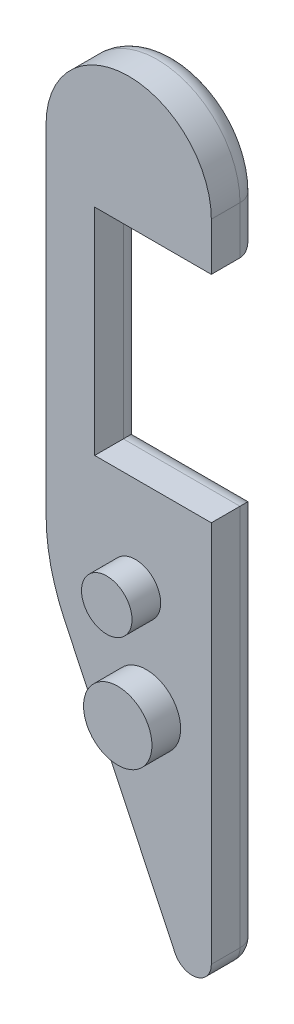
ISO-10303-21;
HEADER;
FILE_DESCRIPTION(('STEP AP214'),'2;1');
FILE_NAME('part.step','',(''),(''),'','','');
FILE_SCHEMA(('AUTOMOTIVE_DESIGN { 1 0 10303 214 1 1 1 1 }'));
ENDSEC;
DATA;
#1=APPLICATION_CONTEXT('core data for automotive mechanical design processes');
#2=APPLICATION_PROTOCOL_DEFINITION('international standard','automotive_design',2000,#1);
#3=PRODUCT_CONTEXT('',#1,'mechanical');
#4=PRODUCT('Part','Part','',(#3));
#5=PRODUCT_RELATED_PRODUCT_CATEGORY('part','',(#4));
#6=PRODUCT_DEFINITION_FORMATION('','',#4);
#7=PRODUCT_DEFINITION_CONTEXT('part definition',#1,'design');
#8=PRODUCT_DEFINITION('design','',#6,#7);
#9=PRODUCT_DEFINITION_SHAPE('','',#8);
#10=(LENGTH_UNIT() NAMED_UNIT(*) SI_UNIT(.MILLI.,.METRE.));
#11=(NAMED_UNIT(*) PLANE_ANGLE_UNIT() SI_UNIT($,.RADIAN.));
#12=(NAMED_UNIT(*) SI_UNIT($,.STERADIAN.) SOLID_ANGLE_UNIT());
#13=UNCERTAINTY_MEASURE_WITH_UNIT(LENGTH_MEASURE(1.E-05),#10,'distance_accuracy_value','');
#14=(GEOMETRIC_REPRESENTATION_CONTEXT(3) GLOBAL_UNCERTAINTY_ASSIGNED_CONTEXT((#13)) GLOBAL_UNIT_ASSIGNED_CONTEXT((#10,
#11,#12)) REPRESENTATION_CONTEXT('',''));
#15=CARTESIAN_POINT('',(0.,0.,0.));
#16=DIRECTION('',(0.,0.,1.));
#17=DIRECTION('',(1.,0.,0.));
#18=AXIS2_PLACEMENT_3D('',#15,#16,#17);
#19=CARTESIAN_POINT('',(-2.,-62.5,5.));
#20=DIRECTION('',(0.,0.,-1.));
#21=DIRECTION('',(-1.,0.,0.));
#22=AXIS2_PLACEMENT_3D('',#19,#20,#21);
#23=PLANE('',#22);
#24=CARTESIAN_POINT('',(-7.93890135304665,-32.4257826385121,5.));
#25=DIRECTION('',(0.,0.,-1.));
#26=DIRECTION('',(-1.,0.,0.));
#27=AXIS2_PLACEMENT_3D('',#24,#25,#26);
#28=CIRCLE('',#27,2.64022715758472);
#29=CARTESIAN_POINT('',(-10.5791285106314,-32.4257826385121,5.));
#30=VERTEX_POINT('',#29);
#31=EDGE_CURVE('E163',#30,#30,#28,.F.);
#32=ORIENTED_EDGE('',*,*,#31,.F.);
#33=EDGE_LOOP('',(#32));
#34=FACE_BOUND('',#33,.T.);
#35=DIRECTION('',(0.,1.,0.));
#36=VECTOR('',#35,1.);
#37=CARTESIAN_POINT('',(0.,5.,5.));
#38=LINE('',#37,#36);
#39=CARTESIAN_POINT('',(0.,0.,5.));
#40=VERTEX_POINT('',#39);
#41=CARTESIAN_POINT('',(0.,5.,5.));
#42=VERTEX_POINT('',#41);
#43=EDGE_CURVE('E152',#40,#42,#38,.T.);
#44=ORIENTED_EDGE('',*,*,#43,.T.);
#45=CARTESIAN_POINT('',(-8.64219265839779,5.,5.));
#46=DIRECTION('',(0.,0.,1.));
#47=DIRECTION('',(-1.,0.,0.));
#48=AXIS2_PLACEMENT_3D('',#45,#46,#47);
#49=CIRCLE('',#48,8.64219265839779);
#50=CARTESIAN_POINT('',(-17.2843853167956,5.,5.));
#51=VERTEX_POINT('',#50);
#52=EDGE_CURVE('E140',#42,#51,#49,.T.);
#53=ORIENTED_EDGE('',*,*,#52,.T.);
#54=DIRECTION('',(0.,-1.,0.));
#55=VECTOR('',#54,1.);
#56=CARTESIAN_POINT('',(-17.2843853167956,-30.408869997568,5.));
#57=LINE('',#56,#55);
#58=CARTESIAN_POINT('',(-17.2843853167956,-30.408869997568,5.));
#59=VERTEX_POINT('',#58);
#60=EDGE_CURVE('E151',#51,#59,#57,.T.);
#61=ORIENTED_EDGE('',*,*,#60,.T.);
#62=CARTESIAN_POINT('',(2.71561468320443,-30.4088699975681,5.));
#63=DIRECTION('',(0.,0.,1.));
#64=DIRECTION('',(-1.,0.,0.));
#65=AXIS2_PLACEMENT_3D('',#62,#63,#64);
#66=CIRCLE('',#65,20.);
#67=CARTESIAN_POINT('',(-15.3589688339794,-38.9709626553443,5.));
#68=VERTEX_POINT('',#67);
#69=EDGE_CURVE('E250',#59,#68,#66,.T.);
#70=ORIENTED_EDGE('',*,*,#69,.T.);
#71=DIRECTION('',(0.428104632888809,-0.903729175859194,0.));
#72=VECTOR('',#71,1.);
#73=CARTESIAN_POINT('',(-3.80745835171839,-63.3562092657776,5.));
#74=LINE('',#73,#72);
#75=CARTESIAN_POINT('',(-3.80745835171839,-63.3562092657776,5.));
#76=VERTEX_POINT('',#75);
#77=EDGE_CURVE('E252',#68,#76,#74,.T.);
#78=ORIENTED_EDGE('',*,*,#77,.T.);
#79=CARTESIAN_POINT('',(-2.,-62.5,5.));
#80=DIRECTION('',(0.,0.,1.));
#81=DIRECTION('',(-1.,0.,0.));
#82=AXIS2_PLACEMENT_3D('',#79,#80,#81);
#83=CIRCLE('',#82,2.);
#84=CARTESIAN_POINT('',(0.,-62.5,5.));
#85=VERTEX_POINT('',#84);
#86=EDGE_CURVE('E254',#76,#85,#83,.T.);
#87=ORIENTED_EDGE('',*,*,#86,.T.);
#88=DIRECTION('',(0.,1.,0.));
#89=VECTOR('',#88,1.);
#90=CARTESIAN_POINT('',(0.,-22.5,5.));
#91=LINE('',#90,#89);
#92=CARTESIAN_POINT('',(0.,-22.5,5.));
#93=VERTEX_POINT('',#92);
#94=EDGE_CURVE('E256',#85,#93,#91,.T.);
#95=ORIENTED_EDGE('',*,*,#94,.T.);
#96=DIRECTION('',(-1.,0.,0.));
#97=VECTOR('',#96,1.);
#98=CARTESIAN_POINT('',(-12.2,-22.5,5.));
#99=LINE('',#98,#97);
#100=CARTESIAN_POINT('',(-12.2,-22.5,5.));
#101=VERTEX_POINT('',#100);
#102=EDGE_CURVE('E258',#93,#101,#99,.T.);
#103=ORIENTED_EDGE('',*,*,#102,.T.);
#104=DIRECTION('',(0.,1.,0.));
#105=VECTOR('',#104,1.);
#106=CARTESIAN_POINT('',(-12.2,0.,5.));
#107=LINE('',#106,#105);
#108=CARTESIAN_POINT('',(-12.2,0.,5.));
#109=VERTEX_POINT('',#108);
#110=EDGE_CURVE('E260',#101,#109,#107,.T.);
#111=ORIENTED_EDGE('',*,*,#110,.T.);
#112=DIRECTION('',(1.,0.,0.));
#113=VECTOR('',#112,1.);
#114=CARTESIAN_POINT('',(0.,0.,5.));
#115=LINE('',#114,#113);
#116=EDGE_CURVE('E157',#109,#40,#115,.T.);
#117=ORIENTED_EDGE('',*,*,#116,.T.);
#118=EDGE_LOOP('',(#44,#53,#61,#70,#78,#87,#95,#103,#111,#117));
#119=FACE_BOUND('',#118,.T.);
#120=CARTESIAN_POINT('',(-6.78837663712528,-42.7720231105724,5.));
#121=DIRECTION('',(0.,0.,-1.));
#122=DIRECTION('',(-1.,0.,0.));
#123=AXIS2_PLACEMENT_3D('',#120,#121,#122);
#124=CIRCLE('',#123,3.5783237132683);
#125=CARTESIAN_POINT('',(-10.3667003503936,-42.7720231105724,5.));
#126=VERTEX_POINT('',#125);
#127=EDGE_CURVE('E166',#126,#126,#124,.F.);
#128=ORIENTED_EDGE('',*,*,#127,.F.);
#129=EDGE_LOOP('',(#128));
#130=FACE_BOUND('',#129,.T.);
#131=ADVANCED_FACE('F33',(#34,#119,#130),#23,.F.);
#132=CARTESIAN_POINT('',(0.,5.,5.));
#133=DIRECTION('',(-1.,0.,0.));
#134=DIRECTION('',(0.,-1.,0.));
#135=AXIS2_PLACEMENT_3D('',#132,#133,#134);
#136=PLANE('',#135);
#137=DIRECTION('',(0.,0.,-1.));
#138=VECTOR('',#137,1.);
#139=CARTESIAN_POINT('',(0.,0.,5.));
#140=LINE('',#139,#138);
#141=CARTESIAN_POINT('',(0.,0.,2.));
#142=VERTEX_POINT('',#141);
#143=EDGE_CURVE('E263',#40,#142,#140,.T.);
#144=ORIENTED_EDGE('',*,*,#143,.T.);
#145=DIRECTION('',(0.,1.,0.));
#146=VECTOR('',#145,1.);
#147=CARTESIAN_POINT('',(0.,5.,2.));
#148=LINE('',#147,#146);
#149=CARTESIAN_POINT('',(0.,5.,2.));
#150=VERTEX_POINT('',#149);
#151=EDGE_CURVE('E11',#142,#150,#148,.T.);
#152=ORIENTED_EDGE('',*,*,#151,.T.);
#153=DIRECTION('',(0.,0.,-1.));
#154=VECTOR('',#153,1.);
#155=CARTESIAN_POINT('',(0.,5.,5.));
#156=LINE('',#155,#154);
#157=EDGE_CURVE('E145',#42,#150,#156,.T.);
#158=ORIENTED_EDGE('',*,*,#157,.F.);
#159=ORIENTED_EDGE('',*,*,#43,.F.);
#160=EDGE_LOOP('',(#144,#152,#158,#159));
#161=FACE_BOUND('',#160,.T.);
#162=ADVANCED_FACE('F161',(#161),#136,.F.);
#163=CARTESIAN_POINT('',(-8.64219265839779,5.,5.));
#164=DIRECTION('',(0.,0.,-1.));
#165=DIRECTION('',(-1.,0.,0.));
#166=AXIS2_PLACEMENT_3D('',#163,#164,#165);
#167=CYLINDRICAL_SURFACE('',#166,8.64219265839779);
#168=ORIENTED_EDGE('',*,*,#157,.T.);
#169=CARTESIAN_POINT('',(-8.64219265839779,5.,2.));
#170=DIRECTION('',(0.,0.,-1.));
#171=DIRECTION('',(-1.,0.,0.));
#172=AXIS2_PLACEMENT_3D('',#169,#170,#171);
#173=CIRCLE('',#172,8.64219265839779);
#174=CARTESIAN_POINT('',(-17.2843853167956,5.,2.));
#175=VERTEX_POINT('',#174);
#176=EDGE_CURVE('E174',#150,#175,#173,.F.);
#177=ORIENTED_EDGE('',*,*,#176,.T.);
#178=DIRECTION('',(0.,0.,-1.));
#179=VECTOR('',#178,1.);
#180=CARTESIAN_POINT('',(-17.2843853167956,5.,5.));
#181=LINE('',#180,#179);
#182=EDGE_CURVE('E148',#51,#175,#181,.T.);
#183=ORIENTED_EDGE('',*,*,#182,.F.);
#184=ORIENTED_EDGE('',*,*,#52,.F.);
#185=EDGE_LOOP('',(#168,#177,#183,#184));
#186=FACE_BOUND('',#185,.T.);
#187=ADVANCED_FACE('F142',(#186),#167,.T.);
#188=CARTESIAN_POINT('',(-17.2843853167956,-30.408869997568,5.));
#189=DIRECTION('',(1.,0.,0.));
#190=DIRECTION('',(0.,0.,-1.));
#191=AXIS2_PLACEMENT_3D('',#188,#189,#190);
#192=PLANE('',#191);
#193=ORIENTED_EDGE('',*,*,#182,.T.);
#194=DIRECTION('',(0.,-1.,0.));
#195=VECTOR('',#194,1.);
#196=CARTESIAN_POINT('',(-17.2843853167956,-30.408869997568,2.));
#197=LINE('',#196,#195);
#198=CARTESIAN_POINT('',(-17.2843853167956,-30.408869997568,2.));
#199=VERTEX_POINT('',#198);
#200=EDGE_CURVE('E195',#175,#199,#197,.T.);
#201=ORIENTED_EDGE('',*,*,#200,.T.);
#202=DIRECTION('',(0.,0.,-1.));
#203=VECTOR('',#202,1.);
#204=CARTESIAN_POINT('',(-17.2843853167956,-30.408869997568,5.));
#205=LINE('',#204,#203);
#206=EDGE_CURVE('E168',#59,#199,#205,.T.);
#207=ORIENTED_EDGE('',*,*,#206,.F.);
#208=ORIENTED_EDGE('',*,*,#60,.F.);
#209=EDGE_LOOP('',(#193,#201,#207,#208));
#210=FACE_BOUND('',#209,.T.);
#211=ADVANCED_FACE('F379',(#210),#192,.F.);
#212=CARTESIAN_POINT('',(2.71561468320443,-30.4088699975681,5.));
#213=DIRECTION('',(0.,0.,-1.));
#214=DIRECTION('',(-1.,0.,0.));
#215=AXIS2_PLACEMENT_3D('',#212,#213,#214);
#216=CYLINDRICAL_SURFACE('',#215,20.);
#217=ORIENTED_EDGE('',*,*,#206,.T.);
#218=CARTESIAN_POINT('',(2.71561468320443,-30.4088699975681,2.));
#219=DIRECTION('',(0.,0.,-1.));
#220=DIRECTION('',(-1.,0.,0.));
#221=AXIS2_PLACEMENT_3D('',#218,#219,#220);
#222=CIRCLE('',#221,20.);
#223=CARTESIAN_POINT('',(-15.3589688339794,-38.9709626553443,2.));
#224=VERTEX_POINT('',#223);
#225=EDGE_CURVE('E197',#199,#224,#222,.F.);
#226=ORIENTED_EDGE('',*,*,#225,.T.);
#227=DIRECTION('',(0.,0.,-1.));
#228=VECTOR('',#227,1.);
#229=CARTESIAN_POINT('',(-15.3589688339794,-38.9709626553443,5.));
#230=LINE('',#229,#228);
#231=EDGE_CURVE('E278',#68,#224,#230,.T.);
#232=ORIENTED_EDGE('',*,*,#231,.F.);
#233=ORIENTED_EDGE('',*,*,#69,.F.);
#234=EDGE_LOOP('',(#217,#226,#232,#233));
#235=FACE_BOUND('',#234,.T.);
#236=ADVANCED_FACE('F285',(#235),#216,.T.);
#237=CARTESIAN_POINT('',(-3.80745835171839,-63.3562092657776,5.));
#238=DIRECTION('',(0.903729175859194,0.428104632888809,0.));
#239=DIRECTION('',(-0.428104632888809,0.903729175859194,0.));
#240=AXIS2_PLACEMENT_3D('',#237,#238,#239);
#241=PLANE('',#240);
#242=ORIENTED_EDGE('',*,*,#231,.T.);
#243=DIRECTION('',(0.428104632888809,-0.903729175859194,0.));
#244=VECTOR('',#243,1.);
#245=CARTESIAN_POINT('',(-3.80745835171839,-63.3562092657776,2.));
#246=LINE('',#245,#244);
#247=CARTESIAN_POINT('',(-3.80745835171839,-63.3562092657776,2.));
#248=VERTEX_POINT('',#247);
#249=EDGE_CURVE('E199',#224,#248,#246,.T.);
#250=ORIENTED_EDGE('',*,*,#249,.T.);
#251=DIRECTION('',(0.,0.,-1.));
#252=VECTOR('',#251,1.);
#253=CARTESIAN_POINT('',(-3.80745835171839,-63.3562092657776,5.));
#254=LINE('',#253,#252);
#255=EDGE_CURVE('E275',#76,#248,#254,.T.);
#256=ORIENTED_EDGE('',*,*,#255,.F.);
#257=ORIENTED_EDGE('',*,*,#77,.F.);
#258=EDGE_LOOP('',(#242,#250,#256,#257));
#259=FACE_BOUND('',#258,.T.);
#260=ADVANCED_FACE('F338',(#259),#241,.F.);
#261=CARTESIAN_POINT('',(-2.,-62.5,5.));
#262=DIRECTION('',(0.,0.,-1.));
#263=DIRECTION('',(-1.,0.,0.));
#264=AXIS2_PLACEMENT_3D('',#261,#262,#263);
#265=CYLINDRICAL_SURFACE('',#264,2.);
#266=ORIENTED_EDGE('',*,*,#255,.T.);
#267=CARTESIAN_POINT('',(-2.,-62.5,2.));
#268=DIRECTION('',(0.,0.,-1.));
#269=DIRECTION('',(-1.,0.,0.));
#270=AXIS2_PLACEMENT_3D('',#267,#268,#269);
#271=CIRCLE('',#270,2.);
#272=CARTESIAN_POINT('',(0.,-62.5,2.));
#273=VERTEX_POINT('',#272);
#274=EDGE_CURVE('E201',#248,#273,#271,.F.);
#275=ORIENTED_EDGE('',*,*,#274,.T.);
#276=DIRECTION('',(0.,0.,-1.));
#277=VECTOR('',#276,1.);
#278=CARTESIAN_POINT('',(0.,-62.5,5.));
#279=LINE('',#278,#277);
#280=EDGE_CURVE('E272',#85,#273,#279,.T.);
#281=ORIENTED_EDGE('',*,*,#280,.F.);
#282=ORIENTED_EDGE('',*,*,#86,.F.);
#283=EDGE_LOOP('',(#266,#275,#281,#282));
#284=FACE_BOUND('',#283,.T.);
#285=ADVANCED_FACE('F341',(#284),#265,.T.);
#286=CARTESIAN_POINT('',(0.,-22.5,5.));
#287=DIRECTION('',(-1.,0.,0.));
#288=DIRECTION('',(0.,-1.,0.));
#289=AXIS2_PLACEMENT_3D('',#286,#287,#288);
#290=PLANE('',#289);
#291=ORIENTED_EDGE('',*,*,#280,.T.);
#292=DIRECTION('',(0.,1.,0.));
#293=VECTOR('',#292,1.);
#294=CARTESIAN_POINT('',(0.,-22.5,2.));
#295=LINE('',#294,#293);
#296=CARTESIAN_POINT('',(0.,-22.5,2.));
#297=VERTEX_POINT('',#296);
#298=EDGE_CURVE('E203',#273,#297,#295,.T.);
#299=ORIENTED_EDGE('',*,*,#298,.T.);
#300=DIRECTION('',(0.,0.,-1.));
#301=VECTOR('',#300,1.);
#302=CARTESIAN_POINT('',(0.,-22.5,5.));
#303=LINE('',#302,#301);
#304=EDGE_CURVE('E269',#93,#297,#303,.T.);
#305=ORIENTED_EDGE('',*,*,#304,.F.);
#306=ORIENTED_EDGE('',*,*,#94,.F.);
#307=EDGE_LOOP('',(#291,#299,#305,#306));
#308=FACE_BOUND('',#307,.T.);
#309=ADVANCED_FACE('F329',(#308),#290,.F.);
#310=CARTESIAN_POINT('',(-12.2,-22.5,5.));
#311=DIRECTION('',(0.,-1.,0.));
#312=DIRECTION('',(0.,0.,-1.));
#313=AXIS2_PLACEMENT_3D('',#310,#311,#312);
#314=PLANE('',#313);
#315=ORIENTED_EDGE('',*,*,#304,.T.);
#316=DIRECTION('',(-1.,0.,0.));
#317=VECTOR('',#316,1.);
#318=CARTESIAN_POINT('',(-12.2,-22.5,2.));
#319=LINE('',#318,#317);
#320=CARTESIAN_POINT('',(-12.2,-22.5,2.));
#321=VERTEX_POINT('',#320);
#322=EDGE_CURVE('E205',#297,#321,#319,.T.);
#323=ORIENTED_EDGE('',*,*,#322,.T.);
#324=DIRECTION('',(0.,0.,-1.));
#325=VECTOR('',#324,1.);
#326=CARTESIAN_POINT('',(-12.2,-22.5,5.));
#327=LINE('',#326,#325);
#328=EDGE_CURVE('E267',#101,#321,#327,.T.);
#329=ORIENTED_EDGE('',*,*,#328,.F.);
#330=ORIENTED_EDGE('',*,*,#102,.F.);
#331=EDGE_LOOP('',(#315,#323,#329,#330));
#332=FACE_BOUND('',#331,.T.);
#333=ADVANCED_FACE('F320',(#332),#314,.F.);
#334=CARTESIAN_POINT('',(-12.2,0.,5.));
#335=DIRECTION('',(-1.,0.,0.));
#336=DIRECTION('',(0.,-1.,0.));
#337=AXIS2_PLACEMENT_3D('',#334,#335,#336);
#338=PLANE('',#337);
#339=ORIENTED_EDGE('',*,*,#328,.T.);
#340=DIRECTION('',(0.,1.,0.));
#341=VECTOR('',#340,1.);
#342=CARTESIAN_POINT('',(-12.2,0.,2.));
#343=LINE('',#342,#341);
#344=CARTESIAN_POINT('',(-12.2,0.,2.));
#345=VERTEX_POINT('',#344);
#346=EDGE_CURVE('E57',#321,#345,#343,.T.);
#347=ORIENTED_EDGE('',*,*,#346,.T.);
#348=DIRECTION('',(0.,0.,-1.));
#349=VECTOR('',#348,1.);
#350=CARTESIAN_POINT('',(-12.2,0.,5.));
#351=LINE('',#350,#349);
#352=EDGE_CURVE('E265',#109,#345,#351,.T.);
#353=ORIENTED_EDGE('',*,*,#352,.F.);
#354=ORIENTED_EDGE('',*,*,#110,.F.);
#355=EDGE_LOOP('',(#339,#347,#353,#354));
#356=FACE_BOUND('',#355,.T.);
#357=ADVANCED_FACE('F324',(#356),#338,.F.);
#358=CARTESIAN_POINT('',(0.,0.,5.));
#359=DIRECTION('',(0.,1.,0.));
#360=DIRECTION('',(-1.,0.,0.));
#361=AXIS2_PLACEMENT_3D('',#358,#359,#360);
#362=PLANE('',#361);
#363=ORIENTED_EDGE('',*,*,#352,.T.);
#364=DIRECTION('',(1.,0.,0.));
#365=VECTOR('',#364,1.);
#366=CARTESIAN_POINT('',(0.,0.,2.));
#367=LINE('',#366,#365);
#368=EDGE_CURVE('E42',#345,#142,#367,.T.);
#369=ORIENTED_EDGE('',*,*,#368,.T.);
#370=ORIENTED_EDGE('',*,*,#143,.F.);
#371=ORIENTED_EDGE('',*,*,#116,.F.);
#372=EDGE_LOOP('',(#363,#369,#370,#371));
#373=FACE_BOUND('',#372,.T.);
#374=ADVANCED_FACE('F364',(#373),#362,.F.);
#375=CARTESIAN_POINT('',(-2.,-62.5,0.));
#376=DIRECTION('',(0.,0.,-1.));
#377=DIRECTION('',(-1.,0.,0.));
#378=AXIS2_PLACEMENT_3D('',#375,#376,#377);
#379=PLANE('',#378);
#380=DIRECTION('',(0.,-1.,0.));
#381=VECTOR('',#380,1.);
#382=CARTESIAN_POINT('',(-15.2843853167956,5.,0.));
#383=LINE('',#382,#381);
#384=CARTESIAN_POINT('',(-15.2843853167956,-30.408869997568,0.));
#385=VERTEX_POINT('',#384);
#386=CARTESIAN_POINT('',(-15.2843853167956,5.,0.));
#387=VERTEX_POINT('',#386);
#388=EDGE_CURVE('E190',#385,#387,#383,.F.);
#389=ORIENTED_EDGE('',*,*,#388,.T.);
#390=CARTESIAN_POINT('',(-8.64219265839779,5.,0.));
#391=DIRECTION('',(0.,0.,-1.));
#392=DIRECTION('',(-1.,0.,0.));
#393=AXIS2_PLACEMENT_3D('',#390,#391,#392);
#394=CIRCLE('',#393,6.64219265839779);
#395=CARTESIAN_POINT('',(-2.,5.,0.));
#396=VERTEX_POINT('',#395);
#397=EDGE_CURVE('E192',#387,#396,#394,.T.);
#398=ORIENTED_EDGE('',*,*,#397,.T.);
#399=DIRECTION('',(0.,1.,0.));
#400=VECTOR('',#399,1.);
#401=CARTESIAN_POINT('',(-2.,0.,0.));
#402=LINE('',#401,#400);
#403=CARTESIAN_POINT('',(-2.,2.,0.));
#404=VERTEX_POINT('',#403);
#405=EDGE_CURVE('E176',#396,#404,#402,.F.);
#406=ORIENTED_EDGE('',*,*,#405,.T.);
#407=DIRECTION('',(1.,0.,0.));
#408=VECTOR('',#407,1.);
#409=CARTESIAN_POINT('',(-12.2,2.,0.));
#410=LINE('',#409,#408);
#411=CARTESIAN_POINT('',(-14.2,2.,0.));
#412=VERTEX_POINT('',#411);
#413=EDGE_CURVE('E178',#404,#412,#410,.F.);
#414=ORIENTED_EDGE('',*,*,#413,.T.);
#415=DIRECTION('',(0.,1.,0.));
#416=VECTOR('',#415,1.);
#417=CARTESIAN_POINT('',(-14.2,-22.5,0.));
#418=LINE('',#417,#416);
#419=CARTESIAN_POINT('',(-14.2,-24.5,0.));
#420=VERTEX_POINT('',#419);
#421=EDGE_CURVE('E180',#412,#420,#418,.F.);
#422=ORIENTED_EDGE('',*,*,#421,.T.);
#423=DIRECTION('',(-1.,0.,0.));
#424=VECTOR('',#423,1.);
#425=CARTESIAN_POINT('',(0.,-24.5,0.));
#426=LINE('',#425,#424);
#427=CARTESIAN_POINT('',(-2.,-24.5,0.));
#428=VERTEX_POINT('',#427);
#429=EDGE_CURVE('E182',#420,#428,#426,.F.);
#430=ORIENTED_EDGE('',*,*,#429,.T.);
#431=DIRECTION('',(0.,1.,0.));
#432=VECTOR('',#431,1.);
#433=CARTESIAN_POINT('',(-2.,-62.5,0.));
#434=LINE('',#433,#432);
#435=CARTESIAN_POINT('',(-2.,-62.5,0.));
#436=VERTEX_POINT('',#435);
#437=EDGE_CURVE('E184',#428,#436,#434,.F.);
#438=ORIENTED_EDGE('',*,*,#437,.T.);
#439=DIRECTION('',(0.428104632888809,-0.903729175859194,0.));
#440=VECTOR('',#439,1.);
#441=CARTESIAN_POINT('',(-13.551510482261,-38.1147533895667,0.));
#442=LINE('',#441,#440);
#443=CARTESIAN_POINT('',(-13.551510482261,-38.1147533895667,0.));
#444=VERTEX_POINT('',#443);
#445=EDGE_CURVE('E186',#436,#444,#442,.F.);
#446=ORIENTED_EDGE('',*,*,#445,.T.);
#447=CARTESIAN_POINT('',(2.71561468320443,-30.4088699975681,0.));
#448=DIRECTION('',(0.,0.,-1.));
#449=DIRECTION('',(-1.,0.,0.));
#450=AXIS2_PLACEMENT_3D('',#447,#448,#449);
#451=CIRCLE('',#450,18.);
#452=EDGE_CURVE('E188',#444,#385,#451,.T.);
#453=ORIENTED_EDGE('',*,*,#452,.T.);
#454=EDGE_LOOP('',(#389,#398,#406,#414,#422,#430,#438,#446,#453));
#455=FACE_BOUND('',#454,.T.);
#456=ADVANCED_FACE('F300',(#455),#379,.T.);
#457=CARTESIAN_POINT('',(-7.93890135304665,-32.4257826385121,8.));
#458=DIRECTION('',(0.,0.,-1.));
#459=DIRECTION('',(-1.,0.,0.));
#460=AXIS2_PLACEMENT_3D('',#457,#458,#459);
#461=CYLINDRICAL_SURFACE('',#460,2.64022715758472);
#462=CARTESIAN_POINT('',(-7.93890135304665,-32.4257826385121,8.));
#463=DIRECTION('',(0.,0.,1.));
#464=DIRECTION('',(1.,0.,0.));
#465=AXIS2_PLACEMENT_3D('',#462,#463,#464);
#466=CIRCLE('',#465,2.64022715758472);
#467=CARTESIAN_POINT('',(-5.29867419546193,-32.4257826385121,8.));
#468=VERTEX_POINT('',#467);
#469=EDGE_CURVE('E159',#468,#468,#466,.T.);
#470=ORIENTED_EDGE('',*,*,#469,.F.);
#471=EDGE_LOOP('',(#470));
#472=FACE_BOUND('',#471,.T.);
#473=ORIENTED_EDGE('',*,*,#31,.T.);
#474=EDGE_LOOP('',(#473));
#475=FACE_BOUND('',#474,.T.);
#476=ADVANCED_FACE('F360',(#472,#475),#461,.T.);
#477=CARTESIAN_POINT('',(-7.93890135304665,-32.4257826385121,8.));
#478=DIRECTION('',(0.,0.,1.));
#479=DIRECTION('',(1.,0.,0.));
#480=AXIS2_PLACEMENT_3D('',#477,#478,#479);
#481=PLANE('',#480);
#482=ORIENTED_EDGE('',*,*,#469,.T.);
#483=EDGE_LOOP('',(#482));
#484=FACE_BOUND('',#483,.T.);
#485=ADVANCED_FACE('F469',(#484),#481,.T.);
#486=CARTESIAN_POINT('',(-6.78837663712528,-42.7720231105724,8.));
#487=DIRECTION('',(0.,0.,-1.));
#488=DIRECTION('',(-1.,0.,0.));
#489=AXIS2_PLACEMENT_3D('',#486,#487,#488);
#490=CYLINDRICAL_SURFACE('',#489,3.5783237132683);
#491=CARTESIAN_POINT('',(-6.78837663712528,-42.7720231105724,8.));
#492=DIRECTION('',(0.,0.,1.));
#493=DIRECTION('',(1.,0.,0.));
#494=AXIS2_PLACEMENT_3D('',#491,#492,#493);
#495=CIRCLE('',#494,3.5783237132683);
#496=CARTESIAN_POINT('',(-3.21005292385698,-42.7720231105724,8.));
#497=VERTEX_POINT('',#496);
#498=EDGE_CURVE('E237',#497,#497,#495,.T.);
#499=ORIENTED_EDGE('',*,*,#498,.F.);
#500=EDGE_LOOP('',(#499));
#501=FACE_BOUND('',#500,.T.);
#502=ORIENTED_EDGE('',*,*,#127,.T.);
#503=EDGE_LOOP('',(#502));
#504=FACE_BOUND('',#503,.T.);
#505=ADVANCED_FACE('F460',(#501,#504),#490,.T.);
#506=CARTESIAN_POINT('',(-6.78837663712528,-42.7720231105724,8.));
#507=DIRECTION('',(0.,0.,1.));
#508=DIRECTION('',(1.,0.,0.));
#509=AXIS2_PLACEMENT_3D('',#506,#507,#508);
#510=PLANE('',#509);
#511=ORIENTED_EDGE('',*,*,#498,.T.);
#512=EDGE_LOOP('',(#511));
#513=FACE_BOUND('',#512,.T.);
#514=ADVANCED_FACE('F452',(#513),#510,.T.);
#515=CARTESIAN_POINT('',(-2.,-22.5,2.));
#516=DIRECTION('',(0.,-1.,0.));
#517=DIRECTION('',(1.,0.,0.));
#518=AXIS2_PLACEMENT_3D('',#515,#516,#517);
#519=CYLINDRICAL_SURFACE('',#518,2.);
#520=CARTESIAN_POINT('',(-2.,-62.5,2.));
#521=DIRECTION('',(0.,-1.,0.));
#522=DIRECTION('',(0.,0.,-1.));
#523=AXIS2_PLACEMENT_3D('',#520,#521,#522);
#524=CIRCLE('',#523,2.);
#525=EDGE_CURVE('E230',#436,#273,#524,.T.);
#526=ORIENTED_EDGE('',*,*,#525,.F.);
#527=ORIENTED_EDGE('',*,*,#437,.F.);
#528=CARTESIAN_POINT('',(-2.,-24.5,2.));
#529=DIRECTION('',(0.707106781186548,-0.707106781186547,0.));
#530=DIRECTION('',(0.707106781186547,0.707106781186548,0.));
#531=AXIS2_PLACEMENT_3D('',#528,#529,#530);
#532=ELLIPSE('',#531,2.82842712474619,2.);
#533=EDGE_CURVE('E37',#297,#428,#532,.F.);
#534=ORIENTED_EDGE('',*,*,#533,.F.);
#535=ORIENTED_EDGE('',*,*,#298,.F.);
#536=EDGE_LOOP('',(#526,#527,#534,#535));
#537=FACE_BOUND('',#536,.T.);
#538=ADVANCED_FACE('F35',(#537),#519,.T.);
#539=CARTESIAN_POINT('',(-12.2,-24.5,2.));
#540=DIRECTION('',(1.,0.,0.));
#541=DIRECTION('',(0.,0.,-1.));
#542=AXIS2_PLACEMENT_3D('',#539,#540,#541);
#543=CYLINDRICAL_SURFACE('',#542,2.);
#544=ORIENTED_EDGE('',*,*,#533,.T.);
#545=ORIENTED_EDGE('',*,*,#429,.F.);
#546=CARTESIAN_POINT('',(-14.2,-24.5,2.));
#547=DIRECTION('',(0.707106781186547,-0.707106781186547,0.));
#548=DIRECTION('',(0.707106781186547,0.707106781186548,0.));
#549=AXIS2_PLACEMENT_3D('',#546,#547,#548);
#550=ELLIPSE('',#549,2.82842712474619,2.);
#551=EDGE_CURVE('E228',#321,#420,#550,.F.);
#552=ORIENTED_EDGE('',*,*,#551,.F.);
#553=ORIENTED_EDGE('',*,*,#322,.F.);
#554=EDGE_LOOP('',(#544,#545,#552,#553));
#555=FACE_BOUND('',#554,.T.);
#556=ADVANCED_FACE('F317',(#555),#543,.T.);
#557=CARTESIAN_POINT('',(-2.,-62.5,2.));
#558=DIRECTION('',(0.,0.,1.));
#559=DIRECTION('',(1.,0.,0.));
#560=AXIS2_PLACEMENT_3D('',#557,#558,#559);
#561=SPHERICAL_SURFACE('',#560,2.);
#562=ORIENTED_EDGE('',*,*,#525,.T.);
#563=ORIENTED_EDGE('',*,*,#274,.F.);
#564=CARTESIAN_POINT('',(-2.,-62.5,2.));
#565=DIRECTION('',(-0.428104632888809,0.903729175859194,0.));
#566=DIRECTION('',(-0.903729175859194,-0.428104632888809,0.));
#567=AXIS2_PLACEMENT_3D('',#564,#565,#566);
#568=CIRCLE('',#567,2.);
#569=EDGE_CURVE('E225',#436,#248,#568,.T.);
#570=ORIENTED_EDGE('',*,*,#569,.F.);
#571=EDGE_LOOP('',(#562,#563,#570));
#572=FACE_BOUND('',#571,.T.);
#573=ADVANCED_FACE('F342',(#572),#561,.T.);
#574=CARTESIAN_POINT('',(-14.2,0.,2.));
#575=DIRECTION('',(0.,-1.,0.));
#576=DIRECTION('',(1.,0.,0.));
#577=AXIS2_PLACEMENT_3D('',#574,#575,#576);
#578=CYLINDRICAL_SURFACE('',#577,2.);
#579=ORIENTED_EDGE('',*,*,#551,.T.);
#580=ORIENTED_EDGE('',*,*,#421,.F.);
#581=CARTESIAN_POINT('',(-14.2,2.,2.));
#582=DIRECTION('',(-0.707106781186547,-0.707106781186548,0.));
#583=DIRECTION('',(0.707106781186548,-0.707106781186547,0.));
#584=AXIS2_PLACEMENT_3D('',#581,#582,#583);
#585=ELLIPSE('',#584,2.82842712474619,2.);
#586=EDGE_CURVE('E222',#345,#412,#585,.F.);
#587=ORIENTED_EDGE('',*,*,#586,.F.);
#588=ORIENTED_EDGE('',*,*,#346,.F.);
#589=EDGE_LOOP('',(#579,#580,#587,#588));
#590=FACE_BOUND('',#589,.T.);
#591=ADVANCED_FACE('F314',(#590),#578,.T.);
#592=CARTESIAN_POINT('',(-2.,-62.5,2.));
#593=DIRECTION('',(-0.428104632888809,0.903729175859194,0.));
#594=DIRECTION('',(-0.903729175859194,-0.428104632888809,0.));
#595=AXIS2_PLACEMENT_3D('',#592,#593,#594);
#596=CYLINDRICAL_SURFACE('',#595,2.);
#597=ORIENTED_EDGE('',*,*,#569,.T.);
#598=ORIENTED_EDGE('',*,*,#249,.F.);
#599=CARTESIAN_POINT('',(-13.551510482261,-38.1147533895667,2.));
#600=DIRECTION('',(-0.428104632888813,0.903729175859192,0.));
#601=DIRECTION('',(-0.903729175859192,-0.428104632888813,0.));
#602=AXIS2_PLACEMENT_3D('',#599,#600,#601);
#603=CIRCLE('',#602,2.);
#604=EDGE_CURVE('E219',#444,#224,#603,.T.);
#605=ORIENTED_EDGE('',*,*,#604,.F.);
#606=ORIENTED_EDGE('',*,*,#445,.F.);
#607=EDGE_LOOP('',(#597,#598,#605,#606));
#608=FACE_BOUND('',#607,.T.);
#609=ADVANCED_FACE('F335',(#608),#596,.T.);
#610=CARTESIAN_POINT('',(0.,2.,2.));
#611=DIRECTION('',(-1.,0.,0.));
#612=DIRECTION('',(0.,-1.,0.));
#613=AXIS2_PLACEMENT_3D('',#610,#611,#612);
#614=CYLINDRICAL_SURFACE('',#613,2.);
#615=ORIENTED_EDGE('',*,*,#586,.T.);
#616=ORIENTED_EDGE('',*,*,#413,.F.);
#617=CARTESIAN_POINT('',(-2.,2.,2.));
#618=DIRECTION('',(-0.707106781186547,-0.707106781186547,0.));
#619=DIRECTION('',(0.707106781186547,-0.707106781186548,0.));
#620=AXIS2_PLACEMENT_3D('',#617,#618,#619);
#621=ELLIPSE('',#620,2.82842712474619,2.);
#622=EDGE_CURVE('E216',#142,#404,#621,.F.);
#623=ORIENTED_EDGE('',*,*,#622,.F.);
#624=ORIENTED_EDGE('',*,*,#368,.F.);
#625=EDGE_LOOP('',(#615,#616,#623,#624));
#626=FACE_BOUND('',#625,.T.);
#627=ADVANCED_FACE('F311',(#626),#614,.T.);
#628=CARTESIAN_POINT('',(2.71561468320443,-30.4088699975681,2.));
#629=DIRECTION('',(0.,0.,-1.));
#630=DIRECTION('',(-1.,0.,0.));
#631=AXIS2_PLACEMENT_3D('',#628,#629,#630);
#632=TOROIDAL_SURFACE('',#631,18.,2.);
#633=ORIENTED_EDGE('',*,*,#604,.T.);
#634=ORIENTED_EDGE('',*,*,#225,.F.);
#635=CARTESIAN_POINT('',(-15.2843853167956,-30.408869997568,2.));
#636=DIRECTION('',(0.,1.,0.));
#637=DIRECTION('',(0.,0.,1.));
#638=AXIS2_PLACEMENT_3D('',#635,#636,#637);
#639=CIRCLE('',#638,2.);
#640=EDGE_CURVE('E213',#385,#199,#639,.T.);
#641=ORIENTED_EDGE('',*,*,#640,.F.);
#642=ORIENTED_EDGE('',*,*,#452,.F.);
#643=EDGE_LOOP('',(#633,#634,#641,#642));
#644=FACE_BOUND('',#643,.T.);
#645=ADVANCED_FACE('F290',(#644),#632,.T.);
#646=CARTESIAN_POINT('',(-2.,5.,2.));
#647=DIRECTION('',(0.,-1.,0.));
#648=DIRECTION('',(1.,0.,0.));
#649=AXIS2_PLACEMENT_3D('',#646,#647,#648);
#650=CYLINDRICAL_SURFACE('',#649,2.);
#651=ORIENTED_EDGE('',*,*,#622,.T.);
#652=ORIENTED_EDGE('',*,*,#405,.F.);
#653=CARTESIAN_POINT('',(-2.,5.,2.));
#654=DIRECTION('',(0.,1.,0.));
#655=DIRECTION('',(0.,0.,1.));
#656=AXIS2_PLACEMENT_3D('',#653,#654,#655);
#657=CIRCLE('',#656,2.);
#658=EDGE_CURVE('E211',#150,#396,#657,.T.);
#659=ORIENTED_EDGE('',*,*,#658,.F.);
#660=ORIENTED_EDGE('',*,*,#151,.F.);
#661=EDGE_LOOP('',(#651,#652,#659,#660));
#662=FACE_BOUND('',#661,.T.);
#663=ADVANCED_FACE('F306',(#662),#650,.T.);
#664=CARTESIAN_POINT('',(-15.2843853167956,-30.408869997568,2.));
#665=DIRECTION('',(0.,1.,0.));
#666=DIRECTION('',(0.,0.,1.));
#667=AXIS2_PLACEMENT_3D('',#664,#665,#666);
#668=CYLINDRICAL_SURFACE('',#667,2.);
#669=ORIENTED_EDGE('',*,*,#640,.T.);
#670=ORIENTED_EDGE('',*,*,#200,.F.);
#671=CARTESIAN_POINT('',(-15.2843853167956,5.,2.));
#672=DIRECTION('',(0.,1.,0.));
#673=DIRECTION('',(0.,0.,1.));
#674=AXIS2_PLACEMENT_3D('',#671,#672,#673);
#675=CIRCLE('',#674,2.);
#676=EDGE_CURVE('E209',#387,#175,#675,.T.);
#677=ORIENTED_EDGE('',*,*,#676,.F.);
#678=ORIENTED_EDGE('',*,*,#388,.F.);
#679=EDGE_LOOP('',(#669,#670,#677,#678));
#680=FACE_BOUND('',#679,.T.);
#681=ADVANCED_FACE('F296',(#680),#668,.T.);
#682=CARTESIAN_POINT('',(-8.64219265839779,5.,2.));
#683=DIRECTION('',(0.,0.,-1.));
#684=DIRECTION('',(-1.,0.,0.));
#685=AXIS2_PLACEMENT_3D('',#682,#683,#684);
#686=TOROIDAL_SURFACE('',#685,6.64219265839779,2.);
#687=ORIENTED_EDGE('',*,*,#658,.T.);
#688=ORIENTED_EDGE('',*,*,#397,.F.);
#689=ORIENTED_EDGE('',*,*,#676,.T.);
#690=ORIENTED_EDGE('',*,*,#176,.F.);
#691=EDGE_LOOP('',(#687,#688,#689,#690));
#692=FACE_BOUND('',#691,.T.);
#693=ADVANCED_FACE('F302',(#692),#686,.T.);
#694=CLOSED_SHELL('',(#131,#162,#187,#211,#236,#260,#285,#309,#333,#357,#374,#456,#476,#485,
#505,#514,#538,#556,#573,#591,#609,#627,#645,#663,#681,#693));
#695=MANIFOLD_SOLID_BREP('B2',#694);
#696=ADVANCED_BREP_SHAPE_REPRESENTATION('',(#18,#695),#14);
#697=SHAPE_DEFINITION_REPRESENTATION(#9,#696);
ENDSEC;
END-ISO-10303-21;
